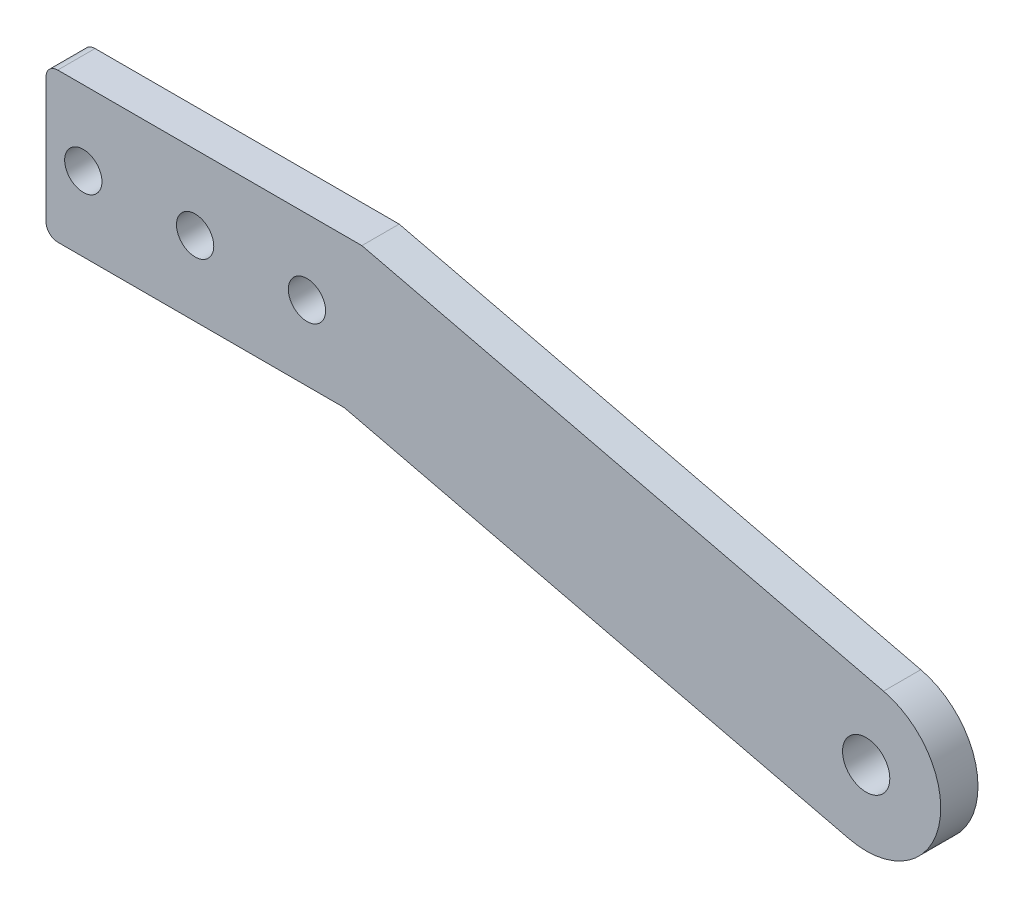
ISO-10303-21;
HEADER;
FILE_DESCRIPTION(('STEP AP214'),'2;1');
FILE_NAME('part.step','',(''),(''),'','','');
FILE_SCHEMA(('AUTOMOTIVE_DESIGN { 1 0 10303 214 1 1 1 1 }'));
ENDSEC;
DATA;
#1=APPLICATION_CONTEXT('core data for automotive mechanical design processes');
#2=APPLICATION_PROTOCOL_DEFINITION('international standard','automotive_design',2000,#1);
#3=PRODUCT_CONTEXT('',#1,'mechanical');
#4=PRODUCT('Part','Part','',(#3));
#5=PRODUCT_RELATED_PRODUCT_CATEGORY('part','',(#4));
#6=PRODUCT_DEFINITION_FORMATION('','',#4);
#7=PRODUCT_DEFINITION_CONTEXT('part definition',#1,'design');
#8=PRODUCT_DEFINITION('design','',#6,#7);
#9=PRODUCT_DEFINITION_SHAPE('','',#8);
#10=(LENGTH_UNIT() NAMED_UNIT(*) SI_UNIT(.MILLI.,.METRE.));
#11=(NAMED_UNIT(*) PLANE_ANGLE_UNIT() SI_UNIT($,.RADIAN.));
#12=(NAMED_UNIT(*) SI_UNIT($,.STERADIAN.) SOLID_ANGLE_UNIT());
#13=UNCERTAINTY_MEASURE_WITH_UNIT(LENGTH_MEASURE(1.E-05),#10,'distance_accuracy_value','');
#14=(GEOMETRIC_REPRESENTATION_CONTEXT(3) GLOBAL_UNCERTAINTY_ASSIGNED_CONTEXT((#13)) GLOBAL_UNIT_ASSIGNED_CONTEXT((#10,
#11,#12)) REPRESENTATION_CONTEXT('',''));
#15=CARTESIAN_POINT('',(0.,0.,0.));
#16=DIRECTION('',(0.,0.,1.));
#17=DIRECTION('',(1.,0.,0.));
#18=AXIS2_PLACEMENT_3D('',#15,#16,#17);
#19=CARTESIAN_POINT('',(88.9,-20.95,6.35));
#20=DIRECTION('',(0.,0.,-1.));
#21=DIRECTION('',(-1.,0.,0.));
#22=AXIS2_PLACEMENT_3D('',#19,#20,#21);
#23=PLANE('',#22);
#24=DIRECTION('',(-1.,0.,0.));
#25=VECTOR('',#24,1.);
#26=CARTESIAN_POINT('',(-48.8,12.7,6.35));
#27=LINE('',#26,#25);
#28=CARTESIAN_POINT('',(3.00173563921521,12.7,6.35));
#29=VERTEX_POINT('',#28);
#30=CARTESIAN_POINT('',(-48.8,12.7,6.35));
#31=VERTEX_POINT('',#30);
#32=EDGE_CURVE('E144',#29,#31,#27,.T.);
#33=ORIENTED_EDGE('',*,*,#32,.T.);
#34=CARTESIAN_POINT('',(-48.8,10.7,6.35));
#35=DIRECTION('',(0.,0.,1.));
#36=DIRECTION('',(1.,0.,0.));
#37=AXIS2_PLACEMENT_3D('',#34,#35,#36);
#38=CIRCLE('',#37,1.99999999999999);
#39=CARTESIAN_POINT('',(-50.8,10.7,6.35));
#40=VERTEX_POINT('',#39);
#41=EDGE_CURVE('E92',#31,#40,#38,.T.);
#42=ORIENTED_EDGE('',*,*,#41,.T.);
#43=DIRECTION('',(0.,-1.,0.));
#44=VECTOR('',#43,1.);
#45=CARTESIAN_POINT('',(-50.8,10.7,6.35));
#46=LINE('',#45,#44);
#47=CARTESIAN_POINT('',(-50.8,-10.7,6.35));
#48=VERTEX_POINT('',#47);
#49=EDGE_CURVE('E159',#40,#48,#46,.T.);
#50=ORIENTED_EDGE('',*,*,#49,.T.);
#51=CARTESIAN_POINT('',(-48.8,-10.7,6.35));
#52=DIRECTION('',(0.,0.,1.));
#53=DIRECTION('',(-1.,0.,0.));
#54=AXIS2_PLACEMENT_3D('',#51,#52,#53);
#55=CIRCLE('',#54,1.99999999999999);
#56=CARTESIAN_POINT('',(-48.8,-12.7,6.35));
#57=VERTEX_POINT('',#56);
#58=EDGE_CURVE('E172',#48,#57,#55,.T.);
#59=ORIENTED_EDGE('',*,*,#58,.T.);
#60=DIRECTION('',(1.,0.,0.));
#61=VECTOR('',#60,1.);
#62=CARTESIAN_POINT('',(-48.8,-12.7,6.35));
#63=LINE('',#62,#61);
#64=CARTESIAN_POINT('',(0.,-12.7,6.35));
#65=VERTEX_POINT('',#64);
#66=EDGE_CURVE('E111',#57,#65,#63,.T.);
#67=ORIENTED_EDGE('',*,*,#66,.T.);
#68=DIRECTION('',(0.972452386669659,-0.233101599437848,0.));
#69=VECTOR('',#68,1.);
#70=CARTESIAN_POINT('',(0.,-12.7,6.35));
#71=LINE('',#70,#69);
#72=CARTESIAN_POINT('',(85.9396096871393,-33.3001453107047,6.35));
#73=VERTEX_POINT('',#72);
#74=EDGE_CURVE('E105',#65,#73,#71,.T.);
#75=ORIENTED_EDGE('',*,*,#74,.T.);
#76=CARTESIAN_POINT('',(88.9,-20.95,6.35));
#77=DIRECTION('',(0.,0.,1.));
#78=DIRECTION('',(-1.,0.,0.));
#79=AXIS2_PLACEMENT_3D('',#76,#77,#78);
#80=CIRCLE('',#79,12.7);
#81=CARTESIAN_POINT('',(91.8603903128607,-8.59985468929531,6.35));
#82=VERTEX_POINT('',#81);
#83=EDGE_CURVE('E109',#73,#82,#80,.T.);
#84=ORIENTED_EDGE('',*,*,#83,.T.);
#85=DIRECTION('',(-0.97245238666966,0.233101599437848,0.));
#86=VECTOR('',#85,1.);
#87=CARTESIAN_POINT('',(91.8603903128607,-8.59985468929531,6.35));
#88=LINE('',#87,#86);
#89=EDGE_CURVE('E49',#82,#29,#88,.T.);
#90=ORIENTED_EDGE('',*,*,#89,.T.);
#91=EDGE_LOOP('',(#33,#42,#50,#59,#67,#75,#84,#90));
#92=FACE_BOUND('',#91,.T.);
#93=CARTESIAN_POINT('',(-6.35,0.,6.35));
#94=DIRECTION('',(0.,0.,1.));
#95=DIRECTION('',(1.,0.,0.));
#96=AXIS2_PLACEMENT_3D('',#93,#94,#95);
#97=CIRCLE('',#96,3.175);
#98=CARTESIAN_POINT('',(-3.17500000000001,0.,6.35));
#99=VERTEX_POINT('',#98);
#100=EDGE_CURVE('E133',#99,#99,#97,.T.);
#101=ORIENTED_EDGE('',*,*,#100,.F.);
#102=EDGE_LOOP('',(#101));
#103=FACE_BOUND('',#102,.T.);
#104=CARTESIAN_POINT('',(88.9,-20.95,6.35));
#105=DIRECTION('',(0.,0.,1.));
#106=DIRECTION('',(1.,0.,0.));
#107=AXIS2_PLACEMENT_3D('',#104,#105,#106);
#108=CIRCLE('',#107,4.025);
#109=CARTESIAN_POINT('',(92.925,-20.95,6.35));
#110=VERTEX_POINT('',#109);
#111=EDGE_CURVE('E181',#110,#110,#108,.T.);
#112=ORIENTED_EDGE('',*,*,#111,.F.);
#113=EDGE_LOOP('',(#112));
#114=FACE_BOUND('',#113,.T.);
#115=CARTESIAN_POINT('',(-25.4,0.,6.35));
#116=DIRECTION('',(0.,0.,1.));
#117=DIRECTION('',(1.,0.,0.));
#118=AXIS2_PLACEMENT_3D('',#115,#116,#117);
#119=CIRCLE('',#118,3.175);
#120=CARTESIAN_POINT('',(-22.225,0.,6.35));
#121=VERTEX_POINT('',#120);
#122=EDGE_CURVE('E187',#121,#121,#119,.T.);
#123=ORIENTED_EDGE('',*,*,#122,.F.);
#124=EDGE_LOOP('',(#123));
#125=FACE_BOUND('',#124,.T.);
#126=CARTESIAN_POINT('',(-44.45,0.,6.35));
#127=DIRECTION('',(0.,0.,1.));
#128=DIRECTION('',(1.,0.,0.));
#129=AXIS2_PLACEMENT_3D('',#126,#127,#128);
#130=CIRCLE('',#129,3.17500000000001);
#131=CARTESIAN_POINT('',(-41.275,0.,6.35));
#132=VERTEX_POINT('',#131);
#133=EDGE_CURVE('E193',#132,#132,#130,.T.);
#134=ORIENTED_EDGE('',*,*,#133,.F.);
#135=EDGE_LOOP('',(#134));
#136=FACE_BOUND('',#135,.T.);
#137=ADVANCED_FACE('F32',(#92,#103,#114,#125,#136),#23,.F.);
#138=CARTESIAN_POINT('',(88.9,-20.95,0.));
#139=DIRECTION('',(0.,0.,-1.));
#140=DIRECTION('',(-1.,0.,0.));
#141=AXIS2_PLACEMENT_3D('',#138,#139,#140);
#142=PLANE('',#141);
#143=CARTESIAN_POINT('',(-25.4,0.,0.));
#144=DIRECTION('',(0.,0.,1.));
#145=DIRECTION('',(1.,0.,0.));
#146=AXIS2_PLACEMENT_3D('',#143,#144,#145);
#147=CIRCLE('',#146,3.175);
#148=CARTESIAN_POINT('',(-22.225,0.,0.));
#149=VERTEX_POINT('',#148);
#150=EDGE_CURVE('E190',#149,#149,#147,.T.);
#151=ORIENTED_EDGE('',*,*,#150,.T.);
#152=EDGE_LOOP('',(#151));
#153=FACE_BOUND('',#152,.T.);
#154=CARTESIAN_POINT('',(-6.35,0.,0.));
#155=DIRECTION('',(0.,0.,1.));
#156=DIRECTION('',(1.,0.,0.));
#157=AXIS2_PLACEMENT_3D('',#154,#155,#156);
#158=CIRCLE('',#157,3.175);
#159=CARTESIAN_POINT('',(-3.17500000000001,0.,0.));
#160=VERTEX_POINT('',#159);
#161=EDGE_CURVE('E178',#160,#160,#158,.T.);
#162=ORIENTED_EDGE('',*,*,#161,.T.);
#163=EDGE_LOOP('',(#162));
#164=FACE_BOUND('',#163,.T.);
#165=DIRECTION('',(-1.,0.,0.));
#166=VECTOR('',#165,1.);
#167=CARTESIAN_POINT('',(-48.8,12.7,0.));
#168=LINE('',#167,#166);
#169=CARTESIAN_POINT('',(3.00173563921521,12.7,0.));
#170=VERTEX_POINT('',#169);
#171=CARTESIAN_POINT('',(-48.8,12.7,0.));
#172=VERTEX_POINT('',#171);
#173=EDGE_CURVE('E129',#170,#172,#168,.T.);
#174=ORIENTED_EDGE('',*,*,#173,.F.);
#175=DIRECTION('',(-0.97245238666966,0.233101599437848,0.));
#176=VECTOR('',#175,1.);
#177=CARTESIAN_POINT('',(91.8603903128607,-8.59985468929531,0.));
#178=LINE('',#177,#176);
#179=CARTESIAN_POINT('',(91.8603903128607,-8.59985468929531,0.));
#180=VERTEX_POINT('',#179);
#181=EDGE_CURVE('E84',#180,#170,#178,.T.);
#182=ORIENTED_EDGE('',*,*,#181,.F.);
#183=CARTESIAN_POINT('',(88.9,-20.95,0.));
#184=DIRECTION('',(0.,0.,1.));
#185=DIRECTION('',(-1.,0.,0.));
#186=AXIS2_PLACEMENT_3D('',#183,#184,#185);
#187=CIRCLE('',#186,12.7);
#188=CARTESIAN_POINT('',(85.9396096871393,-33.3001453107047,0.));
#189=VERTEX_POINT('',#188);
#190=EDGE_CURVE('E78',#189,#180,#187,.T.);
#191=ORIENTED_EDGE('',*,*,#190,.F.);
#192=DIRECTION('',(0.972452386669659,-0.233101599437848,0.));
#193=VECTOR('',#192,1.);
#194=CARTESIAN_POINT('',(0.,-12.7,0.));
#195=LINE('',#194,#193);
#196=CARTESIAN_POINT('',(0.,-12.7,0.));
#197=VERTEX_POINT('',#196);
#198=EDGE_CURVE('E119',#197,#189,#195,.T.);
#199=ORIENTED_EDGE('',*,*,#198,.F.);
#200=DIRECTION('',(1.,0.,0.));
#201=VECTOR('',#200,1.);
#202=CARTESIAN_POINT('',(-48.8,-12.7,0.));
#203=LINE('',#202,#201);
#204=CARTESIAN_POINT('',(-48.8,-12.7,0.));
#205=VERTEX_POINT('',#204);
#206=EDGE_CURVE('E139',#205,#197,#203,.T.);
#207=ORIENTED_EDGE('',*,*,#206,.F.);
#208=CARTESIAN_POINT('',(-48.8,-10.7,0.));
#209=DIRECTION('',(0.,0.,1.));
#210=DIRECTION('',(-1.,0.,0.));
#211=AXIS2_PLACEMENT_3D('',#208,#209,#210);
#212=CIRCLE('',#211,1.99999999999999);
#213=CARTESIAN_POINT('',(-50.8,-10.7,0.));
#214=VERTEX_POINT('',#213);
#215=EDGE_CURVE('E137',#214,#205,#212,.T.);
#216=ORIENTED_EDGE('',*,*,#215,.F.);
#217=DIRECTION('',(0.,-1.,0.));
#218=VECTOR('',#217,1.);
#219=CARTESIAN_POINT('',(-50.8,10.7,0.));
#220=LINE('',#219,#218);
#221=CARTESIAN_POINT('',(-50.8,10.7,0.));
#222=VERTEX_POINT('',#221);
#223=EDGE_CURVE('E135',#222,#214,#220,.T.);
#224=ORIENTED_EDGE('',*,*,#223,.F.);
#225=CARTESIAN_POINT('',(-48.8,10.7,0.));
#226=DIRECTION('',(0.,0.,1.));
#227=DIRECTION('',(1.,0.,0.));
#228=AXIS2_PLACEMENT_3D('',#225,#226,#227);
#229=CIRCLE('',#228,1.99999999999999);
#230=EDGE_CURVE('E132',#172,#222,#229,.T.);
#231=ORIENTED_EDGE('',*,*,#230,.F.);
#232=EDGE_LOOP('',(#174,#182,#191,#199,#207,#216,#224,#231));
#233=FACE_BOUND('',#232,.T.);
#234=CARTESIAN_POINT('',(88.9,-20.95,0.));
#235=DIRECTION('',(0.,0.,1.));
#236=DIRECTION('',(1.,0.,0.));
#237=AXIS2_PLACEMENT_3D('',#234,#235,#236);
#238=CIRCLE('',#237,4.025);
#239=CARTESIAN_POINT('',(92.925,-20.95,0.));
#240=VERTEX_POINT('',#239);
#241=EDGE_CURVE('E184',#240,#240,#238,.T.);
#242=ORIENTED_EDGE('',*,*,#241,.T.);
#243=EDGE_LOOP('',(#242));
#244=FACE_BOUND('',#243,.T.);
#245=CARTESIAN_POINT('',(-44.45,0.,0.));
#246=DIRECTION('',(0.,0.,1.));
#247=DIRECTION('',(1.,0.,0.));
#248=AXIS2_PLACEMENT_3D('',#245,#246,#247);
#249=CIRCLE('',#248,3.17500000000001);
#250=CARTESIAN_POINT('',(-41.275,0.,0.));
#251=VERTEX_POINT('',#250);
#252=EDGE_CURVE('E196',#251,#251,#249,.T.);
#253=ORIENTED_EDGE('',*,*,#252,.T.);
#254=EDGE_LOOP('',(#253));
#255=FACE_BOUND('',#254,.T.);
#256=ADVANCED_FACE('F163',(#153,#164,#233,#244,#255),#142,.T.);
#257=CARTESIAN_POINT('',(-48.8,12.7,6.35));
#258=DIRECTION('',(0.,-1.,0.));
#259=DIRECTION('',(1.,0.,0.));
#260=AXIS2_PLACEMENT_3D('',#257,#258,#259);
#261=PLANE('',#260);
#262=ORIENTED_EDGE('',*,*,#173,.T.);
#263=DIRECTION('',(0.,0.,-1.));
#264=VECTOR('',#263,1.);
#265=CARTESIAN_POINT('',(-48.8,12.7,6.35));
#266=LINE('',#265,#264);
#267=EDGE_CURVE('E11',#31,#172,#266,.T.);
#268=ORIENTED_EDGE('',*,*,#267,.F.);
#269=ORIENTED_EDGE('',*,*,#32,.F.);
#270=DIRECTION('',(0.,0.,-1.));
#271=VECTOR('',#270,1.);
#272=CARTESIAN_POINT('',(3.00173563921521,12.7,6.35));
#273=LINE('',#272,#271);
#274=EDGE_CURVE('E125',#29,#170,#273,.T.);
#275=ORIENTED_EDGE('',*,*,#274,.T.);
#276=EDGE_LOOP('',(#262,#268,#269,#275));
#277=FACE_BOUND('',#276,.T.);
#278=ADVANCED_FACE('F34',(#277),#261,.F.);
#279=CARTESIAN_POINT('',(-48.8,10.7,6.35));
#280=DIRECTION('',(0.,0.,-1.));
#281=DIRECTION('',(-1.,0.,0.));
#282=AXIS2_PLACEMENT_3D('',#279,#280,#281);
#283=CYLINDRICAL_SURFACE('',#282,1.99999999999999);
#284=ORIENTED_EDGE('',*,*,#230,.T.);
#285=DIRECTION('',(0.,0.,-1.));
#286=VECTOR('',#285,1.);
#287=CARTESIAN_POINT('',(-50.8,10.7,6.35));
#288=LINE('',#287,#286);
#289=EDGE_CURVE('E41',#40,#222,#288,.T.);
#290=ORIENTED_EDGE('',*,*,#289,.F.);
#291=ORIENTED_EDGE('',*,*,#41,.F.);
#292=ORIENTED_EDGE('',*,*,#267,.T.);
#293=EDGE_LOOP('',(#284,#290,#291,#292));
#294=FACE_BOUND('',#293,.T.);
#295=ADVANCED_FACE('F228',(#294),#283,.T.);
#296=CARTESIAN_POINT('',(-50.8,10.7,6.35));
#297=DIRECTION('',(1.,0.,0.));
#298=DIRECTION('',(0.,1.,0.));
#299=AXIS2_PLACEMENT_3D('',#296,#297,#298);
#300=PLANE('',#299);
#301=ORIENTED_EDGE('',*,*,#223,.T.);
#302=DIRECTION('',(0.,0.,-1.));
#303=VECTOR('',#302,1.);
#304=CARTESIAN_POINT('',(-50.8,-10.7,6.35));
#305=LINE('',#304,#303);
#306=EDGE_CURVE('E151',#48,#214,#305,.T.);
#307=ORIENTED_EDGE('',*,*,#306,.F.);
#308=ORIENTED_EDGE('',*,*,#49,.F.);
#309=ORIENTED_EDGE('',*,*,#289,.T.);
#310=EDGE_LOOP('',(#301,#307,#308,#309));
#311=FACE_BOUND('',#310,.T.);
#312=ADVANCED_FACE('F157',(#311),#300,.F.);
#313=CARTESIAN_POINT('',(-48.8,-10.7,6.35));
#314=DIRECTION('',(0.,0.,-1.));
#315=DIRECTION('',(-1.,0.,0.));
#316=AXIS2_PLACEMENT_3D('',#313,#314,#315);
#317=CYLINDRICAL_SURFACE('',#316,1.99999999999999);
#318=ORIENTED_EDGE('',*,*,#215,.T.);
#319=DIRECTION('',(0.,0.,-1.));
#320=VECTOR('',#319,1.);
#321=CARTESIAN_POINT('',(-48.8,-12.7,6.35));
#322=LINE('',#321,#320);
#323=EDGE_CURVE('E148',#57,#205,#322,.T.);
#324=ORIENTED_EDGE('',*,*,#323,.F.);
#325=ORIENTED_EDGE('',*,*,#58,.F.);
#326=ORIENTED_EDGE('',*,*,#306,.T.);
#327=EDGE_LOOP('',(#318,#324,#325,#326));
#328=FACE_BOUND('',#327,.T.);
#329=ADVANCED_FACE('F168',(#328),#317,.T.);
#330=CARTESIAN_POINT('',(-48.8,-12.7,6.35));
#331=DIRECTION('',(0.,1.,0.));
#332=DIRECTION('',(-1.,0.,0.));
#333=AXIS2_PLACEMENT_3D('',#330,#331,#332);
#334=PLANE('',#333);
#335=ORIENTED_EDGE('',*,*,#206,.T.);
#336=DIRECTION('',(0.,0.,-1.));
#337=VECTOR('',#336,1.);
#338=CARTESIAN_POINT('',(0.,-12.7,6.35));
#339=LINE('',#338,#337);
#340=EDGE_CURVE('E120',#65,#197,#339,.T.);
#341=ORIENTED_EDGE('',*,*,#340,.F.);
#342=ORIENTED_EDGE('',*,*,#66,.F.);
#343=ORIENTED_EDGE('',*,*,#323,.T.);
#344=EDGE_LOOP('',(#335,#341,#342,#343));
#345=FACE_BOUND('',#344,.T.);
#346=ADVANCED_FACE('F171',(#345),#334,.F.);
#347=CARTESIAN_POINT('',(0.,-12.7,6.35));
#348=DIRECTION('',(0.233101599437848,0.972452386669659,0.));
#349=DIRECTION('',(-0.972452386669659,0.233101599437848,0.));
#350=AXIS2_PLACEMENT_3D('',#347,#348,#349);
#351=PLANE('',#350);
#352=ORIENTED_EDGE('',*,*,#198,.T.);
#353=DIRECTION('',(0.,0.,-1.));
#354=VECTOR('',#353,1.);
#355=CARTESIAN_POINT('',(85.9396096871393,-33.3001453107047,6.35));
#356=LINE('',#355,#354);
#357=EDGE_CURVE('E116',#73,#189,#356,.T.);
#358=ORIENTED_EDGE('',*,*,#357,.F.);
#359=ORIENTED_EDGE('',*,*,#74,.F.);
#360=ORIENTED_EDGE('',*,*,#340,.T.);
#361=EDGE_LOOP('',(#352,#358,#359,#360));
#362=FACE_BOUND('',#361,.T.);
#363=ADVANCED_FACE('F117',(#362),#351,.F.);
#364=CARTESIAN_POINT('',(88.9,-20.95,6.35));
#365=DIRECTION('',(0.,0.,-1.));
#366=DIRECTION('',(-1.,0.,0.));
#367=AXIS2_PLACEMENT_3D('',#364,#365,#366);
#368=CYLINDRICAL_SURFACE('',#367,12.7);
#369=ORIENTED_EDGE('',*,*,#190,.T.);
#370=DIRECTION('',(0.,0.,-1.));
#371=VECTOR('',#370,1.);
#372=CARTESIAN_POINT('',(91.8603903128607,-8.59985468929531,6.35));
#373=LINE('',#372,#371);
#374=EDGE_CURVE('E121',#82,#180,#373,.T.);
#375=ORIENTED_EDGE('',*,*,#374,.F.);
#376=ORIENTED_EDGE('',*,*,#83,.F.);
#377=ORIENTED_EDGE('',*,*,#357,.T.);
#378=EDGE_LOOP('',(#369,#375,#376,#377));
#379=FACE_BOUND('',#378,.T.);
#380=ADVANCED_FACE('F123',(#379),#368,.T.);
#381=CARTESIAN_POINT('',(91.8603903128607,-8.59985468929531,6.35));
#382=DIRECTION('',(-0.233101599437848,-0.972452386669659,0.));
#383=DIRECTION('',(0.97245238666966,-0.233101599437848,0.));
#384=AXIS2_PLACEMENT_3D('',#381,#382,#383);
#385=PLANE('',#384);
#386=ORIENTED_EDGE('',*,*,#181,.T.);
#387=ORIENTED_EDGE('',*,*,#274,.F.);
#388=ORIENTED_EDGE('',*,*,#89,.F.);
#389=ORIENTED_EDGE('',*,*,#374,.T.);
#390=EDGE_LOOP('',(#386,#387,#388,#389));
#391=FACE_BOUND('',#390,.T.);
#392=ADVANCED_FACE('F216',(#391),#385,.F.);
#393=CARTESIAN_POINT('',(-6.35,0.,6.35));
#394=DIRECTION('',(0.,0.,-1.));
#395=DIRECTION('',(-1.,0.,0.));
#396=AXIS2_PLACEMENT_3D('',#393,#394,#395);
#397=CYLINDRICAL_SURFACE('',#396,3.175);
#398=ORIENTED_EDGE('',*,*,#100,.T.);
#399=EDGE_LOOP('',(#398));
#400=FACE_BOUND('',#399,.T.);
#401=ORIENTED_EDGE('',*,*,#161,.F.);
#402=EDGE_LOOP('',(#401));
#403=FACE_BOUND('',#402,.T.);
#404=ADVANCED_FACE('F213',(#400,#403),#397,.F.);
#405=CARTESIAN_POINT('',(88.9,-20.95,6.35));
#406=DIRECTION('',(0.,0.,-1.));
#407=DIRECTION('',(-1.,0.,0.));
#408=AXIS2_PLACEMENT_3D('',#405,#406,#407);
#409=CYLINDRICAL_SURFACE('',#408,4.025);
#410=ORIENTED_EDGE('',*,*,#111,.T.);
#411=EDGE_LOOP('',(#410));
#412=FACE_BOUND('',#411,.T.);
#413=ORIENTED_EDGE('',*,*,#241,.F.);
#414=EDGE_LOOP('',(#413));
#415=FACE_BOUND('',#414,.T.);
#416=ADVANCED_FACE('F292',(#412,#415),#409,.F.);
#417=CARTESIAN_POINT('',(-25.4,0.,6.35));
#418=DIRECTION('',(0.,0.,-1.));
#419=DIRECTION('',(-1.,0.,0.));
#420=AXIS2_PLACEMENT_3D('',#417,#418,#419);
#421=CYLINDRICAL_SURFACE('',#420,3.175);
#422=ORIENTED_EDGE('',*,*,#122,.T.);
#423=EDGE_LOOP('',(#422));
#424=FACE_BOUND('',#423,.T.);
#425=ORIENTED_EDGE('',*,*,#150,.F.);
#426=EDGE_LOOP('',(#425));
#427=FACE_BOUND('',#426,.T.);
#428=ADVANCED_FACE('F300',(#424,#427),#421,.F.);
#429=CARTESIAN_POINT('',(-44.45,0.,6.35));
#430=DIRECTION('',(0.,0.,-1.));
#431=DIRECTION('',(-1.,0.,0.));
#432=AXIS2_PLACEMENT_3D('',#429,#430,#431);
#433=CYLINDRICAL_SURFACE('',#432,3.17500000000001);
#434=ORIENTED_EDGE('',*,*,#133,.T.);
#435=EDGE_LOOP('',(#434));
#436=FACE_BOUND('',#435,.T.);
#437=ORIENTED_EDGE('',*,*,#252,.F.);
#438=EDGE_LOOP('',(#437));
#439=FACE_BOUND('',#438,.T.);
#440=ADVANCED_FACE('F202',(#436,#439),#433,.F.);
#441=CLOSED_SHELL('',(#137,#256,#278,#295,#312,#329,#346,#363,#380,#392,#404,#416,#428,#440));
#442=MANIFOLD_SOLID_BREP('B2',#441);
#443=ADVANCED_BREP_SHAPE_REPRESENTATION('',(#18,#442),#14);
#444=SHAPE_DEFINITION_REPRESENTATION(#9,#443);
ENDSEC;
END-ISO-10303-21;
